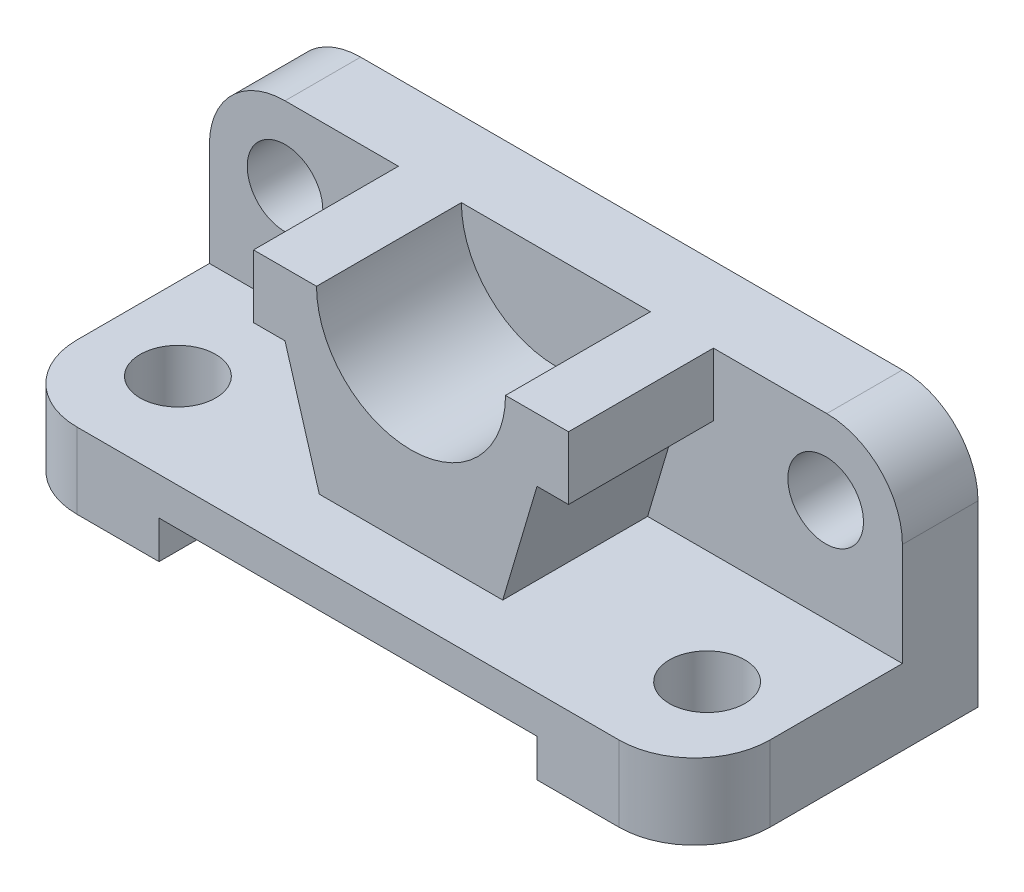
ISO-10303-21;
HEADER;
FILE_DESCRIPTION(('STEP AP214'),'2;1');
FILE_NAME('part.step','',(''),(''),'','','');
FILE_SCHEMA(('AUTOMOTIVE_DESIGN { 1 0 10303 214 1 1 1 1 }'));
ENDSEC;
DATA;
#1=APPLICATION_CONTEXT('core data for automotive mechanical design processes');
#2=APPLICATION_PROTOCOL_DEFINITION('international standard','automotive_design',2000,#1);
#3=PRODUCT_CONTEXT('',#1,'mechanical');
#4=PRODUCT('Part','Part','',(#3));
#5=PRODUCT_RELATED_PRODUCT_CATEGORY('part','',(#4));
#6=PRODUCT_DEFINITION_FORMATION('','',#4);
#7=PRODUCT_DEFINITION_CONTEXT('part definition',#1,'design');
#8=PRODUCT_DEFINITION('design','',#6,#7);
#9=PRODUCT_DEFINITION_SHAPE('','',#8);
#10=(LENGTH_UNIT() NAMED_UNIT(*) SI_UNIT(.MILLI.,.METRE.));
#11=(NAMED_UNIT(*) PLANE_ANGLE_UNIT() SI_UNIT($,.RADIAN.));
#12=(NAMED_UNIT(*) SI_UNIT($,.STERADIAN.) SOLID_ANGLE_UNIT());
#13=UNCERTAINTY_MEASURE_WITH_UNIT(LENGTH_MEASURE(1.E-05),#10,'distance_accuracy_value','');
#14=(GEOMETRIC_REPRESENTATION_CONTEXT(3) GLOBAL_UNCERTAINTY_ASSIGNED_CONTEXT((#13)) GLOBAL_UNIT_ASSIGNED_CONTEXT((#10,
#11,#12)) REPRESENTATION_CONTEXT('',''));
#15=CARTESIAN_POINT('',(0.,0.,0.));
#16=DIRECTION('',(0.,0.,1.));
#17=DIRECTION('',(1.,0.,0.));
#18=AXIS2_PLACEMENT_3D('',#15,#16,#17);
#19=CARTESIAN_POINT('',(0.,0.,0.));
#20=DIRECTION('',(0.,1.,0.));
#21=DIRECTION('',(0.,0.,1.));
#22=AXIS2_PLACEMENT_3D('',#19,#20,#21);
#23=PLANE('',#22);
#24=CARTESIAN_POINT('',(-42.,0.,7.5));
#25=DIRECTION('',(0.,1.,0.));
#26=DIRECTION('',(0.,0.,1.));
#27=AXIS2_PLACEMENT_3D('',#24,#25,#26);
#28=CIRCLE('',#27,5.99999999999999);
#29=CARTESIAN_POINT('',(-42.,0.,13.5));
#30=VERTEX_POINT('',#29);
#31=EDGE_CURVE('E361',#30,#30,#28,.T.);
#32=ORIENTED_EDGE('',*,*,#31,.T.);
#33=EDGE_LOOP('',(#32));
#34=FACE_BOUND('',#33,.T.);
#35=DIRECTION('',(-1.,0.,0.));
#36=VECTOR('',#35,1.);
#37=CARTESIAN_POINT('',(-55.,0.,-22.5));
#38=LINE('',#37,#36);
#39=CARTESIAN_POINT('',(-30.,0.,-22.5));
#40=VERTEX_POINT('',#39);
#41=CARTESIAN_POINT('',(-55.,0.,-22.5));
#42=VERTEX_POINT('',#41);
#43=EDGE_CURVE('E212',#40,#42,#38,.T.);
#44=ORIENTED_EDGE('',*,*,#43,.F.);
#45=DIRECTION('',(0.,0.,1.));
#46=VECTOR('',#45,1.);
#47=CARTESIAN_POINT('',(-30.,0.,-22.5));
#48=LINE('',#47,#46);
#49=CARTESIAN_POINT('',(-30.,0.,22.5));
#50=VERTEX_POINT('',#49);
#51=EDGE_CURVE('E195',#40,#50,#48,.T.);
#52=ORIENTED_EDGE('',*,*,#51,.T.);
#53=DIRECTION('',(1.,0.,0.));
#54=VECTOR('',#53,1.);
#55=CARTESIAN_POINT('',(-55.,0.,22.5));
#56=LINE('',#55,#54);
#57=CARTESIAN_POINT('',(-43.,0.,22.5));
#58=VERTEX_POINT('',#57);
#59=EDGE_CURVE('E231',#58,#50,#56,.T.);
#60=ORIENTED_EDGE('',*,*,#59,.F.);
#61=CARTESIAN_POINT('',(-43.,0.,10.5));
#62=DIRECTION('',(0.,1.,0.));
#63=DIRECTION('',(0.,0.,1.));
#64=AXIS2_PLACEMENT_3D('',#61,#62,#63);
#65=CIRCLE('',#64,12.);
#66=CARTESIAN_POINT('',(-55.,0.,10.5));
#67=VERTEX_POINT('',#66);
#68=EDGE_CURVE('E247',#58,#67,#65,.F.);
#69=ORIENTED_EDGE('',*,*,#68,.T.);
#70=DIRECTION('',(0.,0.,1.));
#71=VECTOR('',#70,1.);
#72=CARTESIAN_POINT('',(-55.,0.,-22.5));
#73=LINE('',#72,#71);
#74=EDGE_CURVE('E219',#42,#67,#73,.T.);
#75=ORIENTED_EDGE('',*,*,#74,.F.);
#76=EDGE_LOOP('',(#44,#52,#60,#69,#75));
#77=FACE_BOUND('',#76,.T.);
#78=ADVANCED_FACE('F33',(#34,#77),#23,.F.);
#79=CARTESIAN_POINT('',(0.,12.,0.));
#80=DIRECTION('',(0.,1.,0.));
#81=DIRECTION('',(0.,0.,1.));
#82=AXIS2_PLACEMENT_3D('',#79,#80,#81);
#83=PLANE('',#82);
#84=CARTESIAN_POINT('',(42.,12.,7.5));
#85=DIRECTION('',(0.,1.,0.));
#86=DIRECTION('',(0.,0.,1.));
#87=AXIS2_PLACEMENT_3D('',#84,#85,#86);
#88=CIRCLE('',#87,5.99999999999999);
#89=CARTESIAN_POINT('',(42.,12.,13.5));
#90=VERTEX_POINT('',#89);
#91=EDGE_CURVE('E352',#90,#90,#88,.T.);
#92=ORIENTED_EDGE('',*,*,#91,.F.);
#93=EDGE_LOOP('',(#92));
#94=FACE_BOUND('',#93,.T.);
#95=CARTESIAN_POINT('',(-42.,12.,7.5));
#96=DIRECTION('',(0.,1.,0.));
#97=DIRECTION('',(0.,0.,1.));
#98=AXIS2_PLACEMENT_3D('',#95,#96,#97);
#99=CIRCLE('',#98,5.99999999999999);
#100=CARTESIAN_POINT('',(-42.,12.,13.5));
#101=VERTEX_POINT('',#100);
#102=EDGE_CURVE('E358',#101,#101,#99,.T.);
#103=ORIENTED_EDGE('',*,*,#102,.F.);
#104=EDGE_LOOP('',(#103));
#105=FACE_BOUND('',#104,.T.);
#106=DIRECTION('',(1.,0.,0.));
#107=VECTOR('',#106,1.);
#108=CARTESIAN_POINT('',(0.,12.,12.5));
#109=LINE('',#108,#107);
#110=CARTESIAN_POINT('',(-14.5571935897479,12.,12.5));
#111=VERTEX_POINT('',#110);
#112=CARTESIAN_POINT('',(14.5571935897479,12.,12.5));
#113=VERTEX_POINT('',#112);
#114=EDGE_CURVE('E301',#111,#113,#109,.T.);
#115=ORIENTED_EDGE('',*,*,#114,.F.);
#116=DIRECTION('',(0.,0.,-1.));
#117=VECTOR('',#116,1.);
#118=CARTESIAN_POINT('',(-14.5571935897479,12.,0.));
#119=LINE('',#118,#117);
#120=CARTESIAN_POINT('',(-14.5571935897479,12.,-10.5));
#121=VERTEX_POINT('',#120);
#122=EDGE_CURVE('E303',#111,#121,#119,.T.);
#123=ORIENTED_EDGE('',*,*,#122,.T.);
#124=DIRECTION('',(-1.,0.,0.));
#125=VECTOR('',#124,1.);
#126=CARTESIAN_POINT('',(55.,12.,-10.5));
#127=LINE('',#126,#125);
#128=CARTESIAN_POINT('',(-55.,12.,-10.5));
#129=VERTEX_POINT('',#128);
#130=EDGE_CURVE('E293',#121,#129,#127,.T.);
#131=ORIENTED_EDGE('',*,*,#130,.T.);
#132=DIRECTION('',(0.,0.,1.));
#133=VECTOR('',#132,1.);
#134=CARTESIAN_POINT('',(-55.,12.,-22.5));
#135=LINE('',#134,#133);
#136=CARTESIAN_POINT('',(-55.,12.,10.5));
#137=VERTEX_POINT('',#136);
#138=EDGE_CURVE('E309',#129,#137,#135,.T.);
#139=ORIENTED_EDGE('',*,*,#138,.T.);
#140=CARTESIAN_POINT('',(-43.,12.,10.5));
#141=DIRECTION('',(0.,1.,0.));
#142=DIRECTION('',(0.,0.,1.));
#143=AXIS2_PLACEMENT_3D('',#140,#141,#142);
#144=CIRCLE('',#143,12.);
#145=CARTESIAN_POINT('',(-43.,12.,22.5));
#146=VERTEX_POINT('',#145);
#147=EDGE_CURVE('E254',#137,#146,#144,.T.);
#148=ORIENTED_EDGE('',*,*,#147,.T.);
#149=DIRECTION('',(1.,0.,0.));
#150=VECTOR('',#149,1.);
#151=CARTESIAN_POINT('',(-55.,12.,22.5));
#152=LINE('',#151,#150);
#153=CARTESIAN_POINT('',(43.,12.,22.5));
#154=VERTEX_POINT('',#153);
#155=EDGE_CURVE('E237',#146,#154,#152,.T.);
#156=ORIENTED_EDGE('',*,*,#155,.T.);
#157=CARTESIAN_POINT('',(43.,12.,10.5));
#158=DIRECTION('',(0.,1.,0.));
#159=DIRECTION('',(0.,0.,1.));
#160=AXIS2_PLACEMENT_3D('',#157,#158,#159);
#161=CIRCLE('',#160,12.);
#162=CARTESIAN_POINT('',(55.,12.,10.5));
#163=VERTEX_POINT('',#162);
#164=EDGE_CURVE('E252',#154,#163,#161,.T.);
#165=ORIENTED_EDGE('',*,*,#164,.T.);
#166=DIRECTION('',(0.,0.,-1.));
#167=VECTOR('',#166,1.);
#168=CARTESIAN_POINT('',(55.,12.,-22.5));
#169=LINE('',#168,#167);
#170=CARTESIAN_POINT('',(55.,12.,-10.5));
#171=VERTEX_POINT('',#170);
#172=EDGE_CURVE('E233',#163,#171,#169,.T.);
#173=ORIENTED_EDGE('',*,*,#172,.T.);
#174=CARTESIAN_POINT('',(14.5571935897479,12.,-10.5));
#175=VERTEX_POINT('',#174);
#176=EDGE_CURVE('E291',#171,#175,#127,.T.);
#177=ORIENTED_EDGE('',*,*,#176,.T.);
#178=DIRECTION('',(0.,0.,1.));
#179=VECTOR('',#178,1.);
#180=CARTESIAN_POINT('',(14.5571935897479,12.,0.));
#181=LINE('',#180,#179);
#182=EDGE_CURVE('E418',#175,#113,#181,.T.);
#183=ORIENTED_EDGE('',*,*,#182,.T.);
#184=EDGE_LOOP('',(#115,#123,#131,#139,#148,#156,#165,#173,#177,#183));
#185=FACE_BOUND('',#184,.T.);
#186=ADVANCED_FACE('F315',(#94,#105,#185),#83,.T.);
#187=CARTESIAN_POINT('',(0.,0.,-10.5));
#188=DIRECTION('',(0.,0.,1.));
#189=DIRECTION('',(1.,0.,0.));
#190=AXIS2_PLACEMENT_3D('',#187,#188,#189);
#191=PLANE('',#190);
#192=DIRECTION('',(1.,0.,0.));
#193=VECTOR('',#192,1.);
#194=CARTESIAN_POINT('',(55.,40.3610127689604,-10.5));
#195=LINE('',#194,#193);
#196=CARTESIAN_POINT('',(-15.,40.3610127689604,-10.5));
#197=VERTEX_POINT('',#196);
#198=CARTESIAN_POINT('',(15.,40.3610127689604,-10.5));
#199=VERTEX_POINT('',#198);
#200=EDGE_CURVE('E429',#197,#199,#195,.T.);
#201=ORIENTED_EDGE('',*,*,#200,.F.);
#202=CARTESIAN_POINT('',(0.,40.3610127689604,-10.5));
#203=DIRECTION('',(0.,0.,-1.));
#204=DIRECTION('',(1.,0.,0.));
#205=AXIS2_PLACEMENT_3D('',#202,#203,#204);
#206=CIRCLE('',#205,15.);
#207=EDGE_CURVE('E364',#199,#197,#206,.T.);
#208=ORIENTED_EDGE('',*,*,#207,.F.);
#209=EDGE_LOOP('',(#201,#208));
#210=FACE_BOUND('',#209,.T.);
#211=ADVANCED_FACE('F465',(#210),#191,.T.);
#212=CARTESIAN_POINT('',(-43.,28.3610127689604,-10.5));
#213=DIRECTION('',(0.,0.,1.));
#214=DIRECTION('',(1.,0.,0.));
#215=AXIS2_PLACEMENT_3D('',#212,#213,#214);
#216=CIRCLE('',#215,6.00000000000001);
#217=CARTESIAN_POINT('',(-37.,28.3610127689604,-10.5));
#218=VERTEX_POINT('',#217);
#219=EDGE_CURVE('E346',#218,#218,#216,.T.);
#220=ORIENTED_EDGE('',*,*,#219,.F.);
#221=EDGE_LOOP('',(#220));
#222=FACE_BOUND('',#221,.T.);
#223=DIRECTION('',(1.,0.,0.));
#224=VECTOR('',#223,1.);
#225=CARTESIAN_POINT('',(-20.,30.3610127689604,-10.5));
#226=LINE('',#225,#224);
#227=CARTESIAN_POINT('',(-25.,30.3610127689604,-10.5));
#228=VERTEX_POINT('',#227);
#229=CARTESIAN_POINT('',(-20.,30.3610127689604,-10.5));
#230=VERTEX_POINT('',#229);
#231=EDGE_CURVE('E393',#228,#230,#226,.T.);
#232=ORIENTED_EDGE('',*,*,#231,.F.);
#233=DIRECTION('',(0.,-1.,0.));
#234=VECTOR('',#233,1.);
#235=CARTESIAN_POINT('',(-25.,30.3610127689604,-10.5));
#236=LINE('',#235,#234);
#237=CARTESIAN_POINT('',(-25.,40.3610127689604,-10.5));
#238=VERTEX_POINT('',#237);
#239=EDGE_CURVE('E391',#238,#228,#236,.T.);
#240=ORIENTED_EDGE('',*,*,#239,.F.);
#241=CARTESIAN_POINT('',(-43.,40.3610127689604,-10.5));
#242=VERTEX_POINT('',#241);
#243=EDGE_CURVE('E225',#242,#238,#195,.T.);
#244=ORIENTED_EDGE('',*,*,#243,.F.);
#245=CARTESIAN_POINT('',(-43.,28.3610127689604,-10.5));
#246=DIRECTION('',(0.,0.,1.));
#247=DIRECTION('',(1.,0.,0.));
#248=AXIS2_PLACEMENT_3D('',#245,#246,#247);
#249=CIRCLE('',#248,12.);
#250=CARTESIAN_POINT('',(-55.,28.3610127689604,-10.5));
#251=VERTEX_POINT('',#250);
#252=EDGE_CURVE('E274',#242,#251,#249,.T.);
#253=ORIENTED_EDGE('',*,*,#252,.T.);
#254=DIRECTION('',(0.,1.,0.));
#255=VECTOR('',#254,1.);
#256=CARTESIAN_POINT('',(-55.,12.,-10.5));
#257=LINE('',#256,#255);
#258=EDGE_CURVE('E423',#129,#251,#257,.T.);
#259=ORIENTED_EDGE('',*,*,#258,.F.);
#260=ORIENTED_EDGE('',*,*,#130,.F.);
#261=DIRECTION('',(0.284208638937159,-0.958762457313326,0.));
#262=VECTOR('',#261,1.);
#263=CARTESIAN_POINT('',(-11.,0.,-10.5));
#264=LINE('',#263,#262);
#265=EDGE_CURVE('E395',#230,#121,#264,.T.);
#266=ORIENTED_EDGE('',*,*,#265,.F.);
#267=EDGE_LOOP('',(#232,#240,#244,#253,#259,#260,#266));
#268=FACE_BOUND('',#267,.T.);
#269=ADVANCED_FACE('F439',(#222,#268),#191,.T.);
#270=CARTESIAN_POINT('',(42.8205691239219,28.3610127689604,-10.5));
#271=DIRECTION('',(0.,0.,1.));
#272=DIRECTION('',(-1.,0.,0.));
#273=AXIS2_PLACEMENT_3D('',#270,#271,#272);
#274=CIRCLE('',#273,6.00000000000001);
#275=CARTESIAN_POINT('',(36.8205691239219,28.3610127689604,-10.5));
#276=VERTEX_POINT('',#275);
#277=EDGE_CURVE('E339',#276,#276,#274,.T.);
#278=ORIENTED_EDGE('',*,*,#277,.F.);
#279=EDGE_LOOP('',(#278));
#280=FACE_BOUND('',#279,.T.);
#281=DIRECTION('',(1.,0.,0.));
#282=VECTOR('',#281,1.);
#283=CARTESIAN_POINT('',(25.,30.3610127689604,-10.5));
#284=LINE('',#283,#282);
#285=CARTESIAN_POINT('',(20.,30.3610127689604,-10.5));
#286=VERTEX_POINT('',#285);
#287=CARTESIAN_POINT('',(25.,30.3610127689604,-10.5));
#288=VERTEX_POINT('',#287);
#289=EDGE_CURVE('E397',#286,#288,#284,.T.);
#290=ORIENTED_EDGE('',*,*,#289,.F.);
#291=DIRECTION('',(-0.284208638937159,-0.958762457313326,0.));
#292=VECTOR('',#291,1.);
#293=CARTESIAN_POINT('',(10.1114799450884,-2.99737430362773,-10.5));
#294=LINE('',#293,#292);
#295=EDGE_CURVE('E11',#286,#175,#294,.T.);
#296=ORIENTED_EDGE('',*,*,#295,.T.);
#297=ORIENTED_EDGE('',*,*,#176,.F.);
#298=DIRECTION('',(0.,-1.,0.));
#299=VECTOR('',#298,1.);
#300=CARTESIAN_POINT('',(55.,12.,-10.5));
#301=LINE('',#300,#299);
#302=CARTESIAN_POINT('',(55.,28.3610127689604,-10.5));
#303=VERTEX_POINT('',#302);
#304=EDGE_CURVE('E281',#303,#171,#301,.T.);
#305=ORIENTED_EDGE('',*,*,#304,.F.);
#306=CARTESIAN_POINT('',(43.,28.3610127689604,-10.5));
#307=DIRECTION('',(0.,0.,1.));
#308=DIRECTION('',(1.,0.,0.));
#309=AXIS2_PLACEMENT_3D('',#306,#307,#308);
#310=CIRCLE('',#309,12.);
#311=CARTESIAN_POINT('',(43.,40.3610127689604,-10.5));
#312=VERTEX_POINT('',#311);
#313=EDGE_CURVE('E271',#303,#312,#310,.T.);
#314=ORIENTED_EDGE('',*,*,#313,.T.);
#315=CARTESIAN_POINT('',(25.,40.3610127689604,-10.5));
#316=VERTEX_POINT('',#315);
#317=EDGE_CURVE('E300',#316,#312,#195,.T.);
#318=ORIENTED_EDGE('',*,*,#317,.F.);
#319=DIRECTION('',(0.,1.,0.));
#320=VECTOR('',#319,1.);
#321=CARTESIAN_POINT('',(25.,40.3610127689604,-10.5));
#322=LINE('',#321,#320);
#323=EDGE_CURVE('E371',#288,#316,#322,.T.);
#324=ORIENTED_EDGE('',*,*,#323,.F.);
#325=EDGE_LOOP('',(#290,#296,#297,#305,#314,#318,#324));
#326=FACE_BOUND('',#325,.T.);
#327=ADVANCED_FACE('F287',(#280,#326),#191,.T.);
#328=CARTESIAN_POINT('',(55.,12.,-22.5));
#329=DIRECTION('',(-1.,0.,0.));
#330=DIRECTION('',(0.,0.,1.));
#331=AXIS2_PLACEMENT_3D('',#328,#329,#330);
#332=PLANE('',#331);
#333=DIRECTION('',(0.,-1.,0.));
#334=VECTOR('',#333,1.);
#335=CARTESIAN_POINT('',(55.,12.,-22.5));
#336=LINE('',#335,#334);
#337=CARTESIAN_POINT('',(55.,28.3610127689604,-22.5));
#338=VERTEX_POINT('',#337);
#339=CARTESIAN_POINT('',(55.,0.,-22.5));
#340=VERTEX_POINT('',#339);
#341=EDGE_CURVE('E236',#338,#340,#336,.T.);
#342=ORIENTED_EDGE('',*,*,#341,.F.);
#343=DIRECTION('',(0.,0.,-1.));
#344=VECTOR('',#343,1.);
#345=CARTESIAN_POINT('',(55.,28.3610127689604,-10.5));
#346=LINE('',#345,#344);
#347=EDGE_CURVE('E41',#338,#303,#346,.F.);
#348=ORIENTED_EDGE('',*,*,#347,.T.);
#349=ORIENTED_EDGE('',*,*,#304,.T.);
#350=ORIENTED_EDGE('',*,*,#172,.F.);
#351=DIRECTION('',(0.,-1.,0.));
#352=VECTOR('',#351,1.);
#353=CARTESIAN_POINT('',(55.,12.,10.5));
#354=LINE('',#353,#352);
#355=CARTESIAN_POINT('',(55.,0.,10.5));
#356=VERTEX_POINT('',#355);
#357=EDGE_CURVE('E256',#163,#356,#354,.T.);
#358=ORIENTED_EDGE('',*,*,#357,.T.);
#359=DIRECTION('',(0.,0.,-1.));
#360=VECTOR('',#359,1.);
#361=CARTESIAN_POINT('',(55.,0.,-22.5));
#362=LINE('',#361,#360);
#363=EDGE_CURVE('E221',#356,#340,#362,.T.);
#364=ORIENTED_EDGE('',*,*,#363,.T.);
#365=EDGE_LOOP('',(#342,#348,#349,#350,#358,#364));
#366=FACE_BOUND('',#365,.T.);
#367=ADVANCED_FACE('F279',(#366),#332,.F.);
#368=CARTESIAN_POINT('',(-55.,12.,-22.5));
#369=DIRECTION('',(0.,0.,1.));
#370=DIRECTION('',(1.,0.,0.));
#371=AXIS2_PLACEMENT_3D('',#368,#369,#370);
#372=PLANE('',#371);
#373=CARTESIAN_POINT('',(42.8205691239219,28.3610127689604,-22.5));
#374=DIRECTION('',(0.,0.,1.));
#375=DIRECTION('',(-1.,0.,0.));
#376=AXIS2_PLACEMENT_3D('',#373,#374,#375);
#377=CIRCLE('',#376,6.00000000000001);
#378=CARTESIAN_POINT('',(36.8205691239219,28.3610127689604,-22.5));
#379=VERTEX_POINT('',#378);
#380=EDGE_CURVE('E343',#379,#379,#377,.T.);
#381=ORIENTED_EDGE('',*,*,#380,.T.);
#382=EDGE_LOOP('',(#381));
#383=FACE_BOUND('',#382,.T.);
#384=CARTESIAN_POINT('',(-43.,28.3610127689604,-22.5));
#385=DIRECTION('',(0.,0.,1.));
#386=DIRECTION('',(1.,0.,0.));
#387=AXIS2_PLACEMENT_3D('',#384,#385,#386);
#388=CIRCLE('',#387,6.00000000000001);
#389=CARTESIAN_POINT('',(-37.,28.3610127689604,-22.5));
#390=VERTEX_POINT('',#389);
#391=EDGE_CURVE('E349',#390,#390,#388,.T.);
#392=ORIENTED_EDGE('',*,*,#391,.T.);
#393=EDGE_LOOP('',(#392));
#394=FACE_BOUND('',#393,.T.);
#395=DIRECTION('',(-1.,0.,0.));
#396=VECTOR('',#395,1.);
#397=CARTESIAN_POINT('',(-30.,6.,-22.5));
#398=LINE('',#397,#396);
#399=CARTESIAN_POINT('',(30.,6.00000000000001,-22.5));
#400=VERTEX_POINT('',#399);
#401=CARTESIAN_POINT('',(-30.,6.,-22.5));
#402=VERTEX_POINT('',#401);
#403=EDGE_CURVE('E207',#400,#402,#398,.T.);
#404=ORIENTED_EDGE('',*,*,#403,.T.);
#405=DIRECTION('',(0.,-1.,0.));
#406=VECTOR('',#405,1.);
#407=CARTESIAN_POINT('',(-30.,0.,-22.5));
#408=LINE('',#407,#406);
#409=EDGE_CURVE('E198',#402,#40,#408,.T.);
#410=ORIENTED_EDGE('',*,*,#409,.T.);
#411=ORIENTED_EDGE('',*,*,#43,.T.);
#412=DIRECTION('',(0.,-1.,0.));
#413=VECTOR('',#412,1.);
#414=CARTESIAN_POINT('',(-55.,12.,-22.5));
#415=LINE('',#414,#413);
#416=CARTESIAN_POINT('',(-55.,28.3610127689604,-22.5));
#417=VERTEX_POINT('',#416);
#418=EDGE_CURVE('E234',#417,#42,#415,.T.);
#419=ORIENTED_EDGE('',*,*,#418,.F.);
#420=CARTESIAN_POINT('',(-43.,28.3610127689604,-22.5));
#421=DIRECTION('',(0.,0.,1.));
#422=DIRECTION('',(1.,0.,0.));
#423=AXIS2_PLACEMENT_3D('',#420,#421,#422);
#424=CIRCLE('',#423,12.);
#425=CARTESIAN_POINT('',(-43.,40.3610127689604,-22.5));
#426=VERTEX_POINT('',#425);
#427=EDGE_CURVE('E264',#417,#426,#424,.F.);
#428=ORIENTED_EDGE('',*,*,#427,.T.);
#429=DIRECTION('',(1.,0.,0.));
#430=VECTOR('',#429,1.);
#431=CARTESIAN_POINT('',(55.,40.3610127689604,-22.5));
#432=LINE('',#431,#430);
#433=CARTESIAN_POINT('',(43.,40.3610127689604,-22.5));
#434=VERTEX_POINT('',#433);
#435=EDGE_CURVE('E294',#426,#434,#432,.T.);
#436=ORIENTED_EDGE('',*,*,#435,.T.);
#437=CARTESIAN_POINT('',(43.,28.3610127689604,-22.5));
#438=DIRECTION('',(0.,0.,1.));
#439=DIRECTION('',(1.,0.,0.));
#440=AXIS2_PLACEMENT_3D('',#437,#438,#439);
#441=CIRCLE('',#440,12.);
#442=EDGE_CURVE('E262',#434,#338,#441,.F.);
#443=ORIENTED_EDGE('',*,*,#442,.T.);
#444=ORIENTED_EDGE('',*,*,#341,.T.);
#445=CARTESIAN_POINT('',(30.,0.,-22.5));
#446=VERTEX_POINT('',#445);
#447=EDGE_CURVE('E220',#340,#446,#38,.T.);
#448=ORIENTED_EDGE('',*,*,#447,.T.);
#449=DIRECTION('',(0.,1.,0.));
#450=VECTOR('',#449,1.);
#451=CARTESIAN_POINT('',(30.,0.,-22.5));
#452=LINE('',#451,#450);
#453=EDGE_CURVE('E48',#446,#400,#452,.T.);
#454=ORIENTED_EDGE('',*,*,#453,.T.);
#455=EDGE_LOOP('',(#404,#410,#411,#419,#428,#436,#443,#444,#448,#454));
#456=FACE_BOUND('',#455,.T.);
#457=ADVANCED_FACE('F210',(#383,#394,#456),#372,.F.);
#458=CARTESIAN_POINT('',(-55.,12.,-22.5));
#459=DIRECTION('',(1.,0.,0.));
#460=DIRECTION('',(0.,0.,-1.));
#461=AXIS2_PLACEMENT_3D('',#458,#459,#460);
#462=PLANE('',#461);
#463=ORIENTED_EDGE('',*,*,#258,.T.);
#464=DIRECTION('',(0.,0.,-1.));
#465=VECTOR('',#464,1.);
#466=CARTESIAN_POINT('',(-55.,28.3610127689604,-22.5));
#467=LINE('',#466,#465);
#468=EDGE_CURVE('E259',#251,#417,#467,.T.);
#469=ORIENTED_EDGE('',*,*,#468,.T.);
#470=ORIENTED_EDGE('',*,*,#418,.T.);
#471=ORIENTED_EDGE('',*,*,#74,.T.);
#472=DIRECTION('',(0.,-1.,0.));
#473=VECTOR('',#472,1.);
#474=CARTESIAN_POINT('',(-55.,12.,10.5));
#475=LINE('',#474,#473);
#476=EDGE_CURVE('E249',#67,#137,#475,.F.);
#477=ORIENTED_EDGE('',*,*,#476,.T.);
#478=ORIENTED_EDGE('',*,*,#138,.F.);
#479=EDGE_LOOP('',(#463,#469,#470,#471,#477,#478));
#480=FACE_BOUND('',#479,.T.);
#481=ADVANCED_FACE('F442',(#480),#462,.F.);
#482=CARTESIAN_POINT('',(-55.,12.,22.5));
#483=DIRECTION('',(0.,0.,-1.));
#484=DIRECTION('',(-1.,0.,0.));
#485=AXIS2_PLACEMENT_3D('',#482,#483,#484);
#486=PLANE('',#485);
#487=ORIENTED_EDGE('',*,*,#59,.T.);
#488=DIRECTION('',(0.,-1.,0.));
#489=VECTOR('',#488,1.);
#490=CARTESIAN_POINT('',(-30.,0.,22.5));
#491=LINE('',#490,#489);
#492=CARTESIAN_POINT('',(-30.,6.,22.5));
#493=VERTEX_POINT('',#492);
#494=EDGE_CURVE('E201',#493,#50,#491,.T.);
#495=ORIENTED_EDGE('',*,*,#494,.F.);
#496=DIRECTION('',(-1.,0.,0.));
#497=VECTOR('',#496,1.);
#498=CARTESIAN_POINT('',(-30.,6.,22.5));
#499=LINE('',#498,#497);
#500=CARTESIAN_POINT('',(30.,6.00000000000001,22.5));
#501=VERTEX_POINT('',#500);
#502=EDGE_CURVE('E215',#501,#493,#499,.T.);
#503=ORIENTED_EDGE('',*,*,#502,.F.);
#504=DIRECTION('',(0.,1.,0.));
#505=VECTOR('',#504,1.);
#506=CARTESIAN_POINT('',(30.,0.,22.5));
#507=LINE('',#506,#505);
#508=CARTESIAN_POINT('',(30.,0.,22.5));
#509=VERTEX_POINT('',#508);
#510=EDGE_CURVE('E332',#509,#501,#507,.T.);
#511=ORIENTED_EDGE('',*,*,#510,.F.);
#512=CARTESIAN_POINT('',(43.,0.,22.5));
#513=VERTEX_POINT('',#512);
#514=EDGE_CURVE('E230',#509,#513,#56,.T.);
#515=ORIENTED_EDGE('',*,*,#514,.T.);
#516=DIRECTION('',(0.,-1.,0.));
#517=VECTOR('',#516,1.);
#518=CARTESIAN_POINT('',(43.,12.,22.5));
#519=LINE('',#518,#517);
#520=EDGE_CURVE('E239',#513,#154,#519,.F.);
#521=ORIENTED_EDGE('',*,*,#520,.T.);
#522=ORIENTED_EDGE('',*,*,#155,.F.);
#523=DIRECTION('',(0.,-1.,0.));
#524=VECTOR('',#523,1.);
#525=CARTESIAN_POINT('',(-43.,12.,22.5));
#526=LINE('',#525,#524);
#527=EDGE_CURVE('E241',#146,#58,#526,.T.);
#528=ORIENTED_EDGE('',*,*,#527,.T.);
#529=EDGE_LOOP('',(#487,#495,#503,#511,#515,#521,#522,#528));
#530=FACE_BOUND('',#529,.T.);
#531=ADVANCED_FACE('F446',(#530),#486,.F.);
#532=CARTESIAN_POINT('',(42.,0.,7.5));
#533=DIRECTION('',(0.,1.,0.));
#534=DIRECTION('',(0.,0.,1.));
#535=AXIS2_PLACEMENT_3D('',#532,#533,#534);
#536=CIRCLE('',#535,5.99999999999999);
#537=CARTESIAN_POINT('',(42.,0.,13.5));
#538=VERTEX_POINT('',#537);
#539=EDGE_CURVE('E355',#538,#538,#536,.T.);
#540=ORIENTED_EDGE('',*,*,#539,.T.);
#541=EDGE_LOOP('',(#540));
#542=FACE_BOUND('',#541,.T.);
#543=ORIENTED_EDGE('',*,*,#514,.F.);
#544=DIRECTION('',(0.,0.,1.));
#545=VECTOR('',#544,1.);
#546=CARTESIAN_POINT('',(30.,0.,-22.5));
#547=LINE('',#546,#545);
#548=EDGE_CURVE('E206',#446,#509,#547,.T.);
#549=ORIENTED_EDGE('',*,*,#548,.F.);
#550=ORIENTED_EDGE('',*,*,#447,.F.);
#551=ORIENTED_EDGE('',*,*,#363,.F.);
#552=CARTESIAN_POINT('',(43.,0.,10.5));
#553=DIRECTION('',(0.,1.,0.));
#554=DIRECTION('',(0.,0.,1.));
#555=AXIS2_PLACEMENT_3D('',#552,#553,#554);
#556=CIRCLE('',#555,12.);
#557=EDGE_CURVE('E244',#356,#513,#556,.F.);
#558=ORIENTED_EDGE('',*,*,#557,.T.);
#559=EDGE_LOOP('',(#543,#549,#550,#551,#558));
#560=FACE_BOUND('',#559,.T.);
#561=ADVANCED_FACE('F327',(#542,#560),#23,.F.);
#562=CARTESIAN_POINT('',(-43.,12.,10.5));
#563=DIRECTION('',(0.,-1.,0.));
#564=DIRECTION('',(0.,0.,-1.));
#565=AXIS2_PLACEMENT_3D('',#562,#563,#564);
#566=CYLINDRICAL_SURFACE('',#565,12.);
#567=ORIENTED_EDGE('',*,*,#147,.F.);
#568=ORIENTED_EDGE('',*,*,#476,.F.);
#569=ORIENTED_EDGE('',*,*,#68,.F.);
#570=ORIENTED_EDGE('',*,*,#527,.F.);
#571=EDGE_LOOP('',(#567,#568,#569,#570));
#572=FACE_BOUND('',#571,.T.);
#573=ADVANCED_FACE('F445',(#572),#566,.T.);
#574=CARTESIAN_POINT('',(43.,12.,10.5));
#575=DIRECTION('',(0.,-1.,0.));
#576=DIRECTION('',(0.,0.,-1.));
#577=AXIS2_PLACEMENT_3D('',#574,#575,#576);
#578=CYLINDRICAL_SURFACE('',#577,12.);
#579=ORIENTED_EDGE('',*,*,#164,.F.);
#580=ORIENTED_EDGE('',*,*,#520,.F.);
#581=ORIENTED_EDGE('',*,*,#557,.F.);
#582=ORIENTED_EDGE('',*,*,#357,.F.);
#583=EDGE_LOOP('',(#579,#580,#581,#582));
#584=FACE_BOUND('',#583,.T.);
#585=ADVANCED_FACE('F322',(#584),#578,.T.);
#586=CARTESIAN_POINT('',(55.,40.3610127689604,-10.5));
#587=DIRECTION('',(0.,1.,0.));
#588=DIRECTION('',(0.,0.,1.));
#589=AXIS2_PLACEMENT_3D('',#586,#587,#588);
#590=PLANE('',#589);
#591=ORIENTED_EDGE('',*,*,#435,.F.);
#592=DIRECTION('',(0.,0.,-1.));
#593=VECTOR('',#592,1.);
#594=CARTESIAN_POINT('',(-43.,40.3610127689604,-10.5));
#595=LINE('',#594,#593);
#596=EDGE_CURVE('E269',#426,#242,#595,.F.);
#597=ORIENTED_EDGE('',*,*,#596,.T.);
#598=ORIENTED_EDGE('',*,*,#243,.T.);
#599=DIRECTION('',(0.,0.,-1.));
#600=VECTOR('',#599,1.);
#601=CARTESIAN_POINT('',(-25.,40.3610127689604,12.5));
#602=LINE('',#601,#600);
#603=CARTESIAN_POINT('',(-25.,40.3610127689604,12.5));
#604=VERTEX_POINT('',#603);
#605=EDGE_CURVE('E414',#604,#238,#602,.T.);
#606=ORIENTED_EDGE('',*,*,#605,.F.);
#607=DIRECTION('',(-1.,0.,0.));
#608=VECTOR('',#607,1.);
#609=CARTESIAN_POINT('',(-25.,40.3610127689604,12.5));
#610=LINE('',#609,#608);
#611=CARTESIAN_POINT('',(-15.,40.3610127689604,12.5));
#612=VERTEX_POINT('',#611);
#613=EDGE_CURVE('E370',#612,#604,#610,.T.);
#614=ORIENTED_EDGE('',*,*,#613,.F.);
#615=DIRECTION('',(0.,0.,-1.));
#616=VECTOR('',#615,1.);
#617=CARTESIAN_POINT('',(-15.,40.3610127689604,12.5));
#618=LINE('',#617,#616);
#619=EDGE_CURVE('E416',#612,#197,#618,.T.);
#620=ORIENTED_EDGE('',*,*,#619,.T.);
#621=ORIENTED_EDGE('',*,*,#200,.T.);
#622=DIRECTION('',(0.,0.,-1.));
#623=VECTOR('',#622,1.);
#624=CARTESIAN_POINT('',(15.,40.3610127689604,12.5));
#625=LINE('',#624,#623);
#626=CARTESIAN_POINT('',(15.,40.3610127689604,12.5));
#627=VERTEX_POINT('',#626);
#628=EDGE_CURVE('E388',#627,#199,#625,.T.);
#629=ORIENTED_EDGE('',*,*,#628,.F.);
#630=DIRECTION('',(-1.,0.,0.));
#631=VECTOR('',#630,1.);
#632=CARTESIAN_POINT('',(15.,40.3610127689604,12.5));
#633=LINE('',#632,#631);
#634=CARTESIAN_POINT('',(25.,40.3610127689604,12.5));
#635=VERTEX_POINT('',#634);
#636=EDGE_CURVE('E386',#635,#627,#633,.T.);
#637=ORIENTED_EDGE('',*,*,#636,.F.);
#638=DIRECTION('',(0.,0.,-1.));
#639=VECTOR('',#638,1.);
#640=CARTESIAN_POINT('',(25.,40.3610127689604,12.5));
#641=LINE('',#640,#639);
#642=EDGE_CURVE('E56',#635,#316,#641,.T.);
#643=ORIENTED_EDGE('',*,*,#642,.T.);
#644=ORIENTED_EDGE('',*,*,#317,.T.);
#645=DIRECTION('',(0.,0.,-1.));
#646=VECTOR('',#645,1.);
#647=CARTESIAN_POINT('',(43.,40.3610127689604,-22.5));
#648=LINE('',#647,#646);
#649=EDGE_CURVE('E266',#312,#434,#648,.T.);
#650=ORIENTED_EDGE('',*,*,#649,.T.);
#651=EDGE_LOOP('',(#591,#597,#598,#606,#614,#620,#621,#629,#637,#643,#644,#650));
#652=FACE_BOUND('',#651,.T.);
#653=ADVANCED_FACE('F298',(#652),#590,.T.);
#654=CARTESIAN_POINT('',(-43.,28.3610127689604,-22.5));
#655=DIRECTION('',(0.,0.,1.));
#656=DIRECTION('',(1.,0.,0.));
#657=AXIS2_PLACEMENT_3D('',#654,#655,#656);
#658=CYLINDRICAL_SURFACE('',#657,12.);
#659=ORIENTED_EDGE('',*,*,#252,.F.);
#660=ORIENTED_EDGE('',*,*,#596,.F.);
#661=ORIENTED_EDGE('',*,*,#427,.F.);
#662=ORIENTED_EDGE('',*,*,#468,.F.);
#663=EDGE_LOOP('',(#659,#660,#661,#662));
#664=FACE_BOUND('',#663,.T.);
#665=ADVANCED_FACE('F441',(#664),#658,.T.);
#666=CARTESIAN_POINT('',(43.,28.3610127689604,-10.5));
#667=DIRECTION('',(0.,0.,1.));
#668=DIRECTION('',(1.,0.,0.));
#669=AXIS2_PLACEMENT_3D('',#666,#667,#668);
#670=CYLINDRICAL_SURFACE('',#669,12.);
#671=ORIENTED_EDGE('',*,*,#313,.F.);
#672=ORIENTED_EDGE('',*,*,#347,.F.);
#673=ORIENTED_EDGE('',*,*,#442,.F.);
#674=ORIENTED_EDGE('',*,*,#649,.F.);
#675=EDGE_LOOP('',(#671,#672,#673,#674));
#676=FACE_BOUND('',#675,.T.);
#677=ADVANCED_FACE('F35',(#676),#670,.T.);
#678=CARTESIAN_POINT('',(0.,40.3610127689604,12.5));
#679=DIRECTION('',(0.,0.,-1.));
#680=DIRECTION('',(-1.,0.,0.));
#681=AXIS2_PLACEMENT_3D('',#678,#679,#680);
#682=CYLINDRICAL_SURFACE('',#681,15.);
#683=ORIENTED_EDGE('',*,*,#207,.T.);
#684=ORIENTED_EDGE('',*,*,#619,.F.);
#685=CARTESIAN_POINT('',(0.,40.3610127689604,12.5));
#686=DIRECTION('',(0.,0.,-1.));
#687=DIRECTION('',(1.,0.,0.));
#688=AXIS2_PLACEMENT_3D('',#685,#686,#687);
#689=CIRCLE('',#688,15.);
#690=EDGE_CURVE('E367',#627,#612,#689,.T.);
#691=ORIENTED_EDGE('',*,*,#690,.F.);
#692=ORIENTED_EDGE('',*,*,#628,.T.);
#693=EDGE_LOOP('',(#683,#684,#691,#692));
#694=FACE_BOUND('',#693,.T.);
#695=ADVANCED_FACE('F523',(#694),#682,.F.);
#696=CARTESIAN_POINT('',(-25.,30.3610127689604,12.5));
#697=DIRECTION('',(1.,0.,0.));
#698=DIRECTION('',(0.,0.,-1.));
#699=AXIS2_PLACEMENT_3D('',#696,#697,#698);
#700=PLANE('',#699);
#701=ORIENTED_EDGE('',*,*,#239,.T.);
#702=DIRECTION('',(0.,0.,-1.));
#703=VECTOR('',#702,1.);
#704=CARTESIAN_POINT('',(-25.,30.3610127689604,12.5));
#705=LINE('',#704,#703);
#706=CARTESIAN_POINT('',(-25.,30.3610127689604,12.5));
#707=VERTEX_POINT('',#706);
#708=EDGE_CURVE('E411',#707,#228,#705,.T.);
#709=ORIENTED_EDGE('',*,*,#708,.F.);
#710=DIRECTION('',(0.,-1.,0.));
#711=VECTOR('',#710,1.);
#712=CARTESIAN_POINT('',(-25.,30.3610127689604,12.5));
#713=LINE('',#712,#711);
#714=EDGE_CURVE('E373',#604,#707,#713,.T.);
#715=ORIENTED_EDGE('',*,*,#714,.F.);
#716=ORIENTED_EDGE('',*,*,#605,.T.);
#717=EDGE_LOOP('',(#701,#709,#715,#716));
#718=FACE_BOUND('',#717,.T.);
#719=ADVANCED_FACE('F519',(#718),#700,.F.);
#720=CARTESIAN_POINT('',(-20.,30.3610127689604,12.5));
#721=DIRECTION('',(0.,1.,0.));
#722=DIRECTION('',(-1.,0.,0.));
#723=AXIS2_PLACEMENT_3D('',#720,#721,#722);
#724=PLANE('',#723);
#725=ORIENTED_EDGE('',*,*,#231,.T.);
#726=DIRECTION('',(0.,0.,-1.));
#727=VECTOR('',#726,1.);
#728=CARTESIAN_POINT('',(-20.,30.3610127689604,12.5));
#729=LINE('',#728,#727);
#730=CARTESIAN_POINT('',(-20.,30.3610127689604,12.5));
#731=VERTEX_POINT('',#730);
#732=EDGE_CURVE('E408',#731,#230,#729,.T.);
#733=ORIENTED_EDGE('',*,*,#732,.F.);
#734=DIRECTION('',(1.,0.,0.));
#735=VECTOR('',#734,1.);
#736=CARTESIAN_POINT('',(-20.,30.3610127689604,12.5));
#737=LINE('',#736,#735);
#738=EDGE_CURVE('E375',#707,#731,#737,.T.);
#739=ORIENTED_EDGE('',*,*,#738,.F.);
#740=ORIENTED_EDGE('',*,*,#708,.T.);
#741=EDGE_LOOP('',(#725,#733,#739,#740));
#742=FACE_BOUND('',#741,.T.);
#743=ADVANCED_FACE('F515',(#742),#724,.F.);
#744=CARTESIAN_POINT('',(-11.,0.,12.5));
#745=DIRECTION('',(0.958762457313326,0.284208638937159,0.));
#746=DIRECTION('',(-0.284208638937159,0.958762457313326,0.));
#747=AXIS2_PLACEMENT_3D('',#744,#745,#746);
#748=PLANE('',#747);
#749=ORIENTED_EDGE('',*,*,#122,.F.);
#750=DIRECTION('',(0.284208638937159,-0.958762457313326,0.));
#751=VECTOR('',#750,1.);
#752=CARTESIAN_POINT('',(-11.,0.,12.5));
#753=LINE('',#752,#751);
#754=EDGE_CURVE('E377',#731,#111,#753,.T.);
#755=ORIENTED_EDGE('',*,*,#754,.F.);
#756=ORIENTED_EDGE('',*,*,#732,.T.);
#757=ORIENTED_EDGE('',*,*,#265,.T.);
#758=EDGE_LOOP('',(#749,#755,#756,#757));
#759=FACE_BOUND('',#758,.T.);
#760=ADVANCED_FACE('F511',(#759),#748,.F.);
#761=CARTESIAN_POINT('',(20.,30.3610127689604,12.5));
#762=DIRECTION('',(-0.958762457313326,0.284208638937159,0.));
#763=DIRECTION('',(-0.284208638937159,-0.958762457313326,0.));
#764=AXIS2_PLACEMENT_3D('',#761,#762,#763);
#765=PLANE('',#764);
#766=ORIENTED_EDGE('',*,*,#182,.F.);
#767=ORIENTED_EDGE('',*,*,#295,.F.);
#768=DIRECTION('',(0.,0.,-1.));
#769=VECTOR('',#768,1.);
#770=CARTESIAN_POINT('',(20.,30.3610127689604,12.5));
#771=LINE('',#770,#769);
#772=CARTESIAN_POINT('',(20.,30.3610127689604,12.5));
#773=VERTEX_POINT('',#772);
#774=EDGE_CURVE('E405',#773,#286,#771,.T.);
#775=ORIENTED_EDGE('',*,*,#774,.F.);
#776=DIRECTION('',(0.284208638937159,0.958762457313326,0.));
#777=VECTOR('',#776,1.);
#778=CARTESIAN_POINT('',(20.,30.3610127689604,12.5));
#779=LINE('',#778,#777);
#780=EDGE_CURVE('E380',#113,#773,#779,.T.);
#781=ORIENTED_EDGE('',*,*,#780,.F.);
#782=EDGE_LOOP('',(#766,#767,#775,#781));
#783=FACE_BOUND('',#782,.T.);
#784=ADVANCED_FACE('F507',(#783),#765,.F.);
#785=CARTESIAN_POINT('',(25.,30.3610127689604,12.5));
#786=DIRECTION('',(0.,1.,0.));
#787=DIRECTION('',(0.,0.,1.));
#788=AXIS2_PLACEMENT_3D('',#785,#786,#787);
#789=PLANE('',#788);
#790=ORIENTED_EDGE('',*,*,#289,.T.);
#791=DIRECTION('',(0.,0.,-1.));
#792=VECTOR('',#791,1.);
#793=CARTESIAN_POINT('',(25.,30.3610127689604,12.5));
#794=LINE('',#793,#792);
#795=CARTESIAN_POINT('',(25.,30.3610127689604,12.5));
#796=VERTEX_POINT('',#795);
#797=EDGE_CURVE('E402',#796,#288,#794,.T.);
#798=ORIENTED_EDGE('',*,*,#797,.F.);
#799=DIRECTION('',(1.,0.,0.));
#800=VECTOR('',#799,1.);
#801=CARTESIAN_POINT('',(25.,30.3610127689604,12.5));
#802=LINE('',#801,#800);
#803=EDGE_CURVE('E382',#773,#796,#802,.T.);
#804=ORIENTED_EDGE('',*,*,#803,.F.);
#805=ORIENTED_EDGE('',*,*,#774,.T.);
#806=EDGE_LOOP('',(#790,#798,#804,#805));
#807=FACE_BOUND('',#806,.T.);
#808=ADVANCED_FACE('F503',(#807),#789,.F.);
#809=CARTESIAN_POINT('',(25.,40.3610127689604,12.5));
#810=DIRECTION('',(-1.,0.,0.));
#811=DIRECTION('',(0.,0.,1.));
#812=AXIS2_PLACEMENT_3D('',#809,#810,#811);
#813=PLANE('',#812);
#814=ORIENTED_EDGE('',*,*,#323,.T.);
#815=ORIENTED_EDGE('',*,*,#642,.F.);
#816=DIRECTION('',(0.,1.,0.));
#817=VECTOR('',#816,1.);
#818=CARTESIAN_POINT('',(25.,40.3610127689604,12.5));
#819=LINE('',#818,#817);
#820=EDGE_CURVE('E384',#796,#635,#819,.T.);
#821=ORIENTED_EDGE('',*,*,#820,.F.);
#822=ORIENTED_EDGE('',*,*,#797,.T.);
#823=EDGE_LOOP('',(#814,#815,#821,#822));
#824=FACE_BOUND('',#823,.T.);
#825=ADVANCED_FACE('F495',(#824),#813,.F.);
#826=CARTESIAN_POINT('',(0.,40.3610127689604,12.5));
#827=DIRECTION('',(0.,0.,1.));
#828=DIRECTION('',(1.,0.,0.));
#829=AXIS2_PLACEMENT_3D('',#826,#827,#828);
#830=PLANE('',#829);
#831=ORIENTED_EDGE('',*,*,#754,.T.);
#832=ORIENTED_EDGE('',*,*,#114,.T.);
#833=ORIENTED_EDGE('',*,*,#780,.T.);
#834=ORIENTED_EDGE('',*,*,#803,.T.);
#835=ORIENTED_EDGE('',*,*,#820,.T.);
#836=ORIENTED_EDGE('',*,*,#636,.T.);
#837=ORIENTED_EDGE('',*,*,#690,.T.);
#838=ORIENTED_EDGE('',*,*,#613,.T.);
#839=ORIENTED_EDGE('',*,*,#714,.T.);
#840=ORIENTED_EDGE('',*,*,#738,.T.);
#841=EDGE_LOOP('',(#831,#832,#833,#834,#835,#836,#837,#838,#839,#840));
#842=FACE_BOUND('',#841,.T.);
#843=ADVANCED_FACE('F489',(#842),#830,.T.);
#844=CARTESIAN_POINT('',(-42.,0.,7.5));
#845=DIRECTION('',(0.,1.,0.));
#846=DIRECTION('',(0.,0.,1.));
#847=AXIS2_PLACEMENT_3D('',#844,#845,#846);
#848=CYLINDRICAL_SURFACE('',#847,5.99999999999999);
#849=ORIENTED_EDGE('',*,*,#31,.F.);
#850=EDGE_LOOP('',(#849));
#851=FACE_BOUND('',#850,.T.);
#852=ORIENTED_EDGE('',*,*,#102,.T.);
#853=EDGE_LOOP('',(#852));
#854=FACE_BOUND('',#853,.T.);
#855=ADVANCED_FACE('F482',(#851,#854),#848,.F.);
#856=CARTESIAN_POINT('',(42.,0.,7.5));
#857=DIRECTION('',(0.,1.,0.));
#858=DIRECTION('',(0.,0.,1.));
#859=AXIS2_PLACEMENT_3D('',#856,#857,#858);
#860=CYLINDRICAL_SURFACE('',#859,5.99999999999999);
#861=ORIENTED_EDGE('',*,*,#539,.F.);
#862=EDGE_LOOP('',(#861));
#863=FACE_BOUND('',#862,.T.);
#864=ORIENTED_EDGE('',*,*,#91,.T.);
#865=EDGE_LOOP('',(#864));
#866=FACE_BOUND('',#865,.T.);
#867=ADVANCED_FACE('F478',(#863,#866),#860,.F.);
#868=CARTESIAN_POINT('',(-43.,28.3610127689604,-22.5));
#869=DIRECTION('',(0.,0.,1.));
#870=DIRECTION('',(1.,0.,0.));
#871=AXIS2_PLACEMENT_3D('',#868,#869,#870);
#872=CYLINDRICAL_SURFACE('',#871,6.00000000000001);
#873=ORIENTED_EDGE('',*,*,#391,.F.);
#874=EDGE_LOOP('',(#873));
#875=FACE_BOUND('',#874,.T.);
#876=ORIENTED_EDGE('',*,*,#219,.T.);
#877=EDGE_LOOP('',(#876));
#878=FACE_BOUND('',#877,.T.);
#879=ADVANCED_FACE('F481',(#875,#878),#872,.F.);
#880=CARTESIAN_POINT('',(42.8205691239219,28.3610127689604,-22.5));
#881=DIRECTION('',(0.,0.,1.));
#882=DIRECTION('',(1.,0.,0.));
#883=AXIS2_PLACEMENT_3D('',#880,#881,#882);
#884=CYLINDRICAL_SURFACE('',#883,6.00000000000001);
#885=ORIENTED_EDGE('',*,*,#380,.F.);
#886=EDGE_LOOP('',(#885));
#887=FACE_BOUND('',#886,.T.);
#888=ORIENTED_EDGE('',*,*,#277,.T.);
#889=EDGE_LOOP('',(#888));
#890=FACE_BOUND('',#889,.T.);
#891=ADVANCED_FACE('F573',(#887,#890),#884,.F.);
#892=CARTESIAN_POINT('',(-30.,0.,-22.5));
#893=DIRECTION('',(-1.,0.,0.));
#894=DIRECTION('',(0.,0.,1.));
#895=AXIS2_PLACEMENT_3D('',#892,#893,#894);
#896=PLANE('',#895);
#897=ORIENTED_EDGE('',*,*,#494,.T.);
#898=ORIENTED_EDGE('',*,*,#51,.F.);
#899=ORIENTED_EDGE('',*,*,#409,.F.);
#900=DIRECTION('',(0.,0.,1.));
#901=VECTOR('',#900,1.);
#902=CARTESIAN_POINT('',(-30.,6.,-22.5));
#903=LINE('',#902,#901);
#904=EDGE_CURVE('E337',#402,#493,#903,.T.);
#905=ORIENTED_EDGE('',*,*,#904,.T.);
#906=EDGE_LOOP('',(#897,#898,#899,#905));
#907=FACE_BOUND('',#906,.T.);
#908=ADVANCED_FACE('F197',(#907),#896,.F.);
#909=CARTESIAN_POINT('',(-30.,6.,-22.5));
#910=DIRECTION('',(0.,1.,0.));
#911=DIRECTION('',(-1.,0.,0.));
#912=AXIS2_PLACEMENT_3D('',#909,#910,#911);
#913=PLANE('',#912);
#914=ORIENTED_EDGE('',*,*,#502,.T.);
#915=ORIENTED_EDGE('',*,*,#904,.F.);
#916=ORIENTED_EDGE('',*,*,#403,.F.);
#917=DIRECTION('',(0.,0.,1.));
#918=VECTOR('',#917,1.);
#919=CARTESIAN_POINT('',(30.,6.00000000000001,-22.5));
#920=LINE('',#919,#918);
#921=EDGE_CURVE('E340',#400,#501,#920,.T.);
#922=ORIENTED_EDGE('',*,*,#921,.T.);
#923=EDGE_LOOP('',(#914,#915,#916,#922));
#924=FACE_BOUND('',#923,.T.);
#925=ADVANCED_FACE('F450',(#924),#913,.F.);
#926=CARTESIAN_POINT('',(30.,0.,-22.5));
#927=DIRECTION('',(1.,0.,0.));
#928=DIRECTION('',(0.,0.,-1.));
#929=AXIS2_PLACEMENT_3D('',#926,#927,#928);
#930=PLANE('',#929);
#931=ORIENTED_EDGE('',*,*,#510,.T.);
#932=ORIENTED_EDGE('',*,*,#921,.F.);
#933=ORIENTED_EDGE('',*,*,#453,.F.);
#934=ORIENTED_EDGE('',*,*,#548,.T.);
#935=EDGE_LOOP('',(#931,#932,#933,#934));
#936=FACE_BOUND('',#935,.T.);
#937=ADVANCED_FACE('F451',(#936),#930,.F.);
#938=CLOSED_SHELL('',(#78,#186,#211,#269,#327,#367,#457,#481,#531,#561,#573,#585,#653,#665,#677,
#695,#719,#743,#760,#784,#808,#825,#843,#855,#867,#879,#891,#908,#925,#937));
#939=MANIFOLD_SOLID_BREP('B2',#938);
#940=ADVANCED_BREP_SHAPE_REPRESENTATION('',(#18,#939),#14);
#941=SHAPE_DEFINITION_REPRESENTATION(#9,#940);
ENDSEC;
END-ISO-10303-21;
